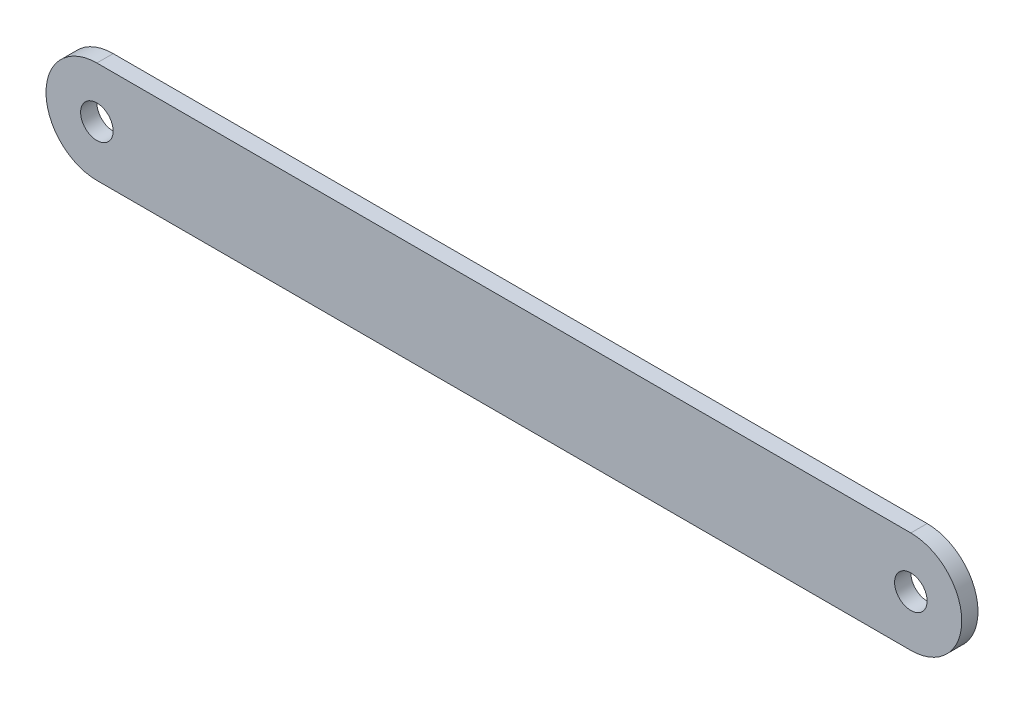
ISO-10303-21;
HEADER;
FILE_DESCRIPTION(('STEP AP214'),'2;1');
FILE_NAME('part.step','',(''),(''),'','','');
FILE_SCHEMA(('AUTOMOTIVE_DESIGN { 1 0 10303 214 1 1 1 1 }'));
ENDSEC;
DATA;
#1=APPLICATION_CONTEXT('core data for automotive mechanical design processes');
#2=APPLICATION_PROTOCOL_DEFINITION('international standard','automotive_design',2000,#1);
#3=PRODUCT_CONTEXT('',#1,'mechanical');
#4=PRODUCT('Part','Part','',(#3));
#5=PRODUCT_RELATED_PRODUCT_CATEGORY('part','',(#4));
#6=PRODUCT_DEFINITION_FORMATION('','',#4);
#7=PRODUCT_DEFINITION_CONTEXT('part definition',#1,'design');
#8=PRODUCT_DEFINITION('design','',#6,#7);
#9=PRODUCT_DEFINITION_SHAPE('','',#8);
#10=(LENGTH_UNIT() NAMED_UNIT(*) SI_UNIT(.MILLI.,.METRE.));
#11=(NAMED_UNIT(*) PLANE_ANGLE_UNIT() SI_UNIT($,.RADIAN.));
#12=(NAMED_UNIT(*) SI_UNIT($,.STERADIAN.) SOLID_ANGLE_UNIT());
#13=UNCERTAINTY_MEASURE_WITH_UNIT(LENGTH_MEASURE(1.E-05),#10,'distance_accuracy_value','');
#14=(GEOMETRIC_REPRESENTATION_CONTEXT(3) GLOBAL_UNCERTAINTY_ASSIGNED_CONTEXT((#13)) GLOBAL_UNIT_ASSIGNED_CONTEXT((#10,
#11,#12)) REPRESENTATION_CONTEXT('',''));
#15=CARTESIAN_POINT('',(0.,0.,0.));
#16=DIRECTION('',(0.,0.,1.));
#17=DIRECTION('',(1.,0.,0.));
#18=AXIS2_PLACEMENT_3D('',#15,#16,#17);
#19=CARTESIAN_POINT('',(-41.00424322704,0.,4.));
#20=DIRECTION('',(0.,0.,1.));
#21=DIRECTION('',(1.,0.,0.));
#22=AXIS2_PLACEMENT_3D('',#19,#20,#21);
#23=PLANE('',#22);
#24=CARTESIAN_POINT('',(-41.00424322704,0.,4.));
#25=DIRECTION('',(0.,0.,1.));
#26=DIRECTION('',(1.,0.,0.));
#27=AXIS2_PLACEMENT_3D('',#24,#25,#26);
#28=CIRCLE('',#27,4.);
#29=CARTESIAN_POINT('',(-37.00424322704,0.,4.));
#30=VERTEX_POINT('',#29);
#31=EDGE_CURVE('E116',#30,#30,#28,.T.);
#32=ORIENTED_EDGE('',*,*,#31,.F.);
#33=EDGE_LOOP('',(#32));
#34=FACE_BOUND('',#33,.T.);
#35=CARTESIAN_POINT('',(-41.00424322704,0.,4.));
#36=DIRECTION('',(0.,0.,1.));
#37=DIRECTION('',(1.,0.,0.));
#38=AXIS2_PLACEMENT_3D('',#35,#36,#37);
#39=CIRCLE('',#38,12.5);
#40=CARTESIAN_POINT('',(-41.00424322704,12.5,4.));
#41=VERTEX_POINT('',#40);
#42=CARTESIAN_POINT('',(-41.00424322704,-12.5,4.));
#43=VERTEX_POINT('',#42);
#44=EDGE_CURVE('E96',#41,#43,#39,.T.);
#45=ORIENTED_EDGE('',*,*,#44,.T.);
#46=DIRECTION('',(1.,0.,0.));
#47=VECTOR('',#46,1.);
#48=CARTESIAN_POINT('',(-41.00424322704,-12.5,4.));
#49=LINE('',#48,#47);
#50=CARTESIAN_POINT('',(158.99575677296,-12.5,4.));
#51=VERTEX_POINT('',#50);
#52=EDGE_CURVE('E91',#43,#51,#49,.T.);
#53=ORIENTED_EDGE('',*,*,#52,.T.);
#54=CARTESIAN_POINT('',(158.99575677296,0.,4.));
#55=DIRECTION('',(0.,0.,1.));
#56=DIRECTION('',(1.,0.,0.));
#57=AXIS2_PLACEMENT_3D('',#54,#55,#56);
#58=CIRCLE('',#57,12.5);
#59=CARTESIAN_POINT('',(158.99575677296,12.5,4.));
#60=VERTEX_POINT('',#59);
#61=EDGE_CURVE('E94',#51,#60,#58,.T.);
#62=ORIENTED_EDGE('',*,*,#61,.T.);
#63=DIRECTION('',(-1.,0.,0.));
#64=VECTOR('',#63,1.);
#65=CARTESIAN_POINT('',(-41.00424322704,12.5,4.));
#66=LINE('',#65,#64);
#67=EDGE_CURVE('E61',#60,#41,#66,.T.);
#68=ORIENTED_EDGE('',*,*,#67,.T.);
#69=EDGE_LOOP('',(#45,#53,#62,#68));
#70=FACE_BOUND('',#69,.T.);
#71=CARTESIAN_POINT('',(158.99575677296,0.,4.));
#72=DIRECTION('',(0.,0.,1.));
#73=DIRECTION('',(1.,0.,0.));
#74=AXIS2_PLACEMENT_3D('',#71,#72,#73);
#75=CIRCLE('',#74,3.99999999999999);
#76=CARTESIAN_POINT('',(162.99575677296,0.,4.));
#77=VERTEX_POINT('',#76);
#78=EDGE_CURVE('E138',#77,#77,#75,.T.);
#79=ORIENTED_EDGE('',*,*,#78,.F.);
#80=EDGE_LOOP('',(#79));
#81=FACE_BOUND('',#80,.T.);
#82=ADVANCED_FACE('F43',(#34,#70,#81),#23,.T.);
#83=CARTESIAN_POINT('',(-41.00424322704,0.,0.));
#84=DIRECTION('',(0.,0.,1.));
#85=DIRECTION('',(1.,0.,0.));
#86=AXIS2_PLACEMENT_3D('',#83,#84,#85);
#87=PLANE('',#86);
#88=CARTESIAN_POINT('',(-41.00424322704,0.,0.));
#89=DIRECTION('',(0.,0.,1.));
#90=DIRECTION('',(1.,0.,0.));
#91=AXIS2_PLACEMENT_3D('',#88,#89,#90);
#92=CIRCLE('',#91,12.5);
#93=CARTESIAN_POINT('',(-41.00424322704,12.5,0.));
#94=VERTEX_POINT('',#93);
#95=CARTESIAN_POINT('',(-41.00424322704,-12.5,0.));
#96=VERTEX_POINT('',#95);
#97=EDGE_CURVE('E112',#94,#96,#92,.T.);
#98=ORIENTED_EDGE('',*,*,#97,.F.);
#99=DIRECTION('',(-1.,0.,0.));
#100=VECTOR('',#99,1.);
#101=CARTESIAN_POINT('',(-41.00424322704,12.5,0.));
#102=LINE('',#101,#100);
#103=CARTESIAN_POINT('',(158.99575677296,12.5,0.));
#104=VERTEX_POINT('',#103);
#105=EDGE_CURVE('E84',#104,#94,#102,.T.);
#106=ORIENTED_EDGE('',*,*,#105,.F.);
#107=CARTESIAN_POINT('',(158.99575677296,0.,0.));
#108=DIRECTION('',(0.,0.,1.));
#109=DIRECTION('',(1.,0.,0.));
#110=AXIS2_PLACEMENT_3D('',#107,#108,#109);
#111=CIRCLE('',#110,12.5);
#112=CARTESIAN_POINT('',(158.99575677296,-12.5,0.));
#113=VERTEX_POINT('',#112);
#114=EDGE_CURVE('E78',#113,#104,#111,.T.);
#115=ORIENTED_EDGE('',*,*,#114,.F.);
#116=DIRECTION('',(1.,0.,0.));
#117=VECTOR('',#116,1.);
#118=CARTESIAN_POINT('',(-41.00424322704,-12.5,0.));
#119=LINE('',#118,#117);
#120=EDGE_CURVE('E101',#96,#113,#119,.T.);
#121=ORIENTED_EDGE('',*,*,#120,.F.);
#122=EDGE_LOOP('',(#98,#106,#115,#121));
#123=FACE_BOUND('',#122,.T.);
#124=CARTESIAN_POINT('',(-41.00424322704,0.,0.));
#125=DIRECTION('',(0.,0.,1.));
#126=DIRECTION('',(1.,0.,0.));
#127=AXIS2_PLACEMENT_3D('',#124,#125,#126);
#128=CIRCLE('',#127,4.);
#129=CARTESIAN_POINT('',(-37.00424322704,0.,0.));
#130=VERTEX_POINT('',#129);
#131=EDGE_CURVE('E134',#130,#130,#128,.T.);
#132=ORIENTED_EDGE('',*,*,#131,.T.);
#133=EDGE_LOOP('',(#132));
#134=FACE_BOUND('',#133,.T.);
#135=CARTESIAN_POINT('',(158.99575677296,0.,0.));
#136=DIRECTION('',(0.,0.,1.));
#137=DIRECTION('',(1.,0.,0.));
#138=AXIS2_PLACEMENT_3D('',#135,#136,#137);
#139=CIRCLE('',#138,3.99999999999999);
#140=CARTESIAN_POINT('',(162.99575677296,0.,0.));
#141=VERTEX_POINT('',#140);
#142=EDGE_CURVE('E142',#141,#141,#139,.T.);
#143=ORIENTED_EDGE('',*,*,#142,.T.);
#144=EDGE_LOOP('',(#143));
#145=FACE_BOUND('',#144,.T.);
#146=ADVANCED_FACE('F129',(#123,#134,#145),#87,.F.);
#147=CARTESIAN_POINT('',(-41.00424322704,0.,4.));
#148=DIRECTION('',(0.,0.,-1.));
#149=DIRECTION('',(-1.,0.,0.));
#150=AXIS2_PLACEMENT_3D('',#147,#148,#149);
#151=CYLINDRICAL_SURFACE('',#150,12.5);
#152=ORIENTED_EDGE('',*,*,#97,.T.);
#153=DIRECTION('',(0.,0.,-1.));
#154=VECTOR('',#153,1.);
#155=CARTESIAN_POINT('',(-41.00424322704,-12.5,4.));
#156=LINE('',#155,#154);
#157=EDGE_CURVE('E11',#43,#96,#156,.T.);
#158=ORIENTED_EDGE('',*,*,#157,.F.);
#159=ORIENTED_EDGE('',*,*,#44,.F.);
#160=DIRECTION('',(0.,0.,-1.));
#161=VECTOR('',#160,1.);
#162=CARTESIAN_POINT('',(-41.00424322704,12.5,4.));
#163=LINE('',#162,#161);
#164=EDGE_CURVE('E108',#41,#94,#163,.T.);
#165=ORIENTED_EDGE('',*,*,#164,.T.);
#166=EDGE_LOOP('',(#152,#158,#159,#165));
#167=FACE_BOUND('',#166,.T.);
#168=ADVANCED_FACE('F45',(#167),#151,.T.);
#169=CARTESIAN_POINT('',(-41.00424322704,-12.5,4.));
#170=DIRECTION('',(0.,1.,0.));
#171=DIRECTION('',(0.,0.,1.));
#172=AXIS2_PLACEMENT_3D('',#169,#170,#171);
#173=PLANE('',#172);
#174=ORIENTED_EDGE('',*,*,#120,.T.);
#175=DIRECTION('',(0.,0.,-1.));
#176=VECTOR('',#175,1.);
#177=CARTESIAN_POINT('',(158.99575677296,-12.5,4.));
#178=LINE('',#177,#176);
#179=EDGE_CURVE('E53',#51,#113,#178,.T.);
#180=ORIENTED_EDGE('',*,*,#179,.F.);
#181=ORIENTED_EDGE('',*,*,#52,.F.);
#182=ORIENTED_EDGE('',*,*,#157,.T.);
#183=EDGE_LOOP('',(#174,#180,#181,#182));
#184=FACE_BOUND('',#183,.T.);
#185=ADVANCED_FACE('F100',(#184),#173,.F.);
#186=CARTESIAN_POINT('',(158.99575677296,0.,4.));
#187=DIRECTION('',(0.,0.,-1.));
#188=DIRECTION('',(-1.,0.,0.));
#189=AXIS2_PLACEMENT_3D('',#186,#187,#188);
#190=CYLINDRICAL_SURFACE('',#189,12.5);
#191=ORIENTED_EDGE('',*,*,#114,.T.);
#192=DIRECTION('',(0.,0.,-1.));
#193=VECTOR('',#192,1.);
#194=CARTESIAN_POINT('',(158.99575677296,12.5,4.));
#195=LINE('',#194,#193);
#196=EDGE_CURVE('E103',#60,#104,#195,.T.);
#197=ORIENTED_EDGE('',*,*,#196,.F.);
#198=ORIENTED_EDGE('',*,*,#61,.F.);
#199=ORIENTED_EDGE('',*,*,#179,.T.);
#200=EDGE_LOOP('',(#191,#197,#198,#199));
#201=FACE_BOUND('',#200,.T.);
#202=ADVANCED_FACE('F104',(#201),#190,.T.);
#203=CARTESIAN_POINT('',(-41.00424322704,12.5,4.));
#204=DIRECTION('',(0.,-1.,0.));
#205=DIRECTION('',(0.,0.,-1.));
#206=AXIS2_PLACEMENT_3D('',#203,#204,#205);
#207=PLANE('',#206);
#208=ORIENTED_EDGE('',*,*,#105,.T.);
#209=ORIENTED_EDGE('',*,*,#164,.F.);
#210=ORIENTED_EDGE('',*,*,#67,.F.);
#211=ORIENTED_EDGE('',*,*,#196,.T.);
#212=EDGE_LOOP('',(#208,#209,#210,#211));
#213=FACE_BOUND('',#212,.T.);
#214=ADVANCED_FACE('F126',(#213),#207,.F.);
#215=CARTESIAN_POINT('',(-41.00424322704,0.,4.));
#216=DIRECTION('',(0.,0.,-1.));
#217=DIRECTION('',(-1.,0.,0.));
#218=AXIS2_PLACEMENT_3D('',#215,#216,#217);
#219=CYLINDRICAL_SURFACE('',#218,4.);
#220=ORIENTED_EDGE('',*,*,#31,.T.);
#221=EDGE_LOOP('',(#220));
#222=FACE_BOUND('',#221,.T.);
#223=ORIENTED_EDGE('',*,*,#131,.F.);
#224=EDGE_LOOP('',(#223));
#225=FACE_BOUND('',#224,.T.);
#226=ADVANCED_FACE('F161',(#222,#225),#219,.F.);
#227=CARTESIAN_POINT('',(158.99575677296,0.,4.));
#228=DIRECTION('',(0.,0.,-1.));
#229=DIRECTION('',(-1.,0.,0.));
#230=AXIS2_PLACEMENT_3D('',#227,#228,#229);
#231=CYLINDRICAL_SURFACE('',#230,3.99999999999999);
#232=ORIENTED_EDGE('',*,*,#78,.T.);
#233=EDGE_LOOP('',(#232));
#234=FACE_BOUND('',#233,.T.);
#235=ORIENTED_EDGE('',*,*,#142,.F.);
#236=EDGE_LOOP('',(#235));
#237=FACE_BOUND('',#236,.T.);
#238=ADVANCED_FACE('F150',(#234,#237),#231,.F.);
#239=CLOSED_SHELL('',(#82,#146,#168,#185,#202,#214,#226,#238));
#240=MANIFOLD_SOLID_BREP('B2',#239);
#241=ADVANCED_BREP_SHAPE_REPRESENTATION('',(#18,#240),#14);
#242=SHAPE_DEFINITION_REPRESENTATION(#9,#241);
ENDSEC;
END-ISO-10303-21;
